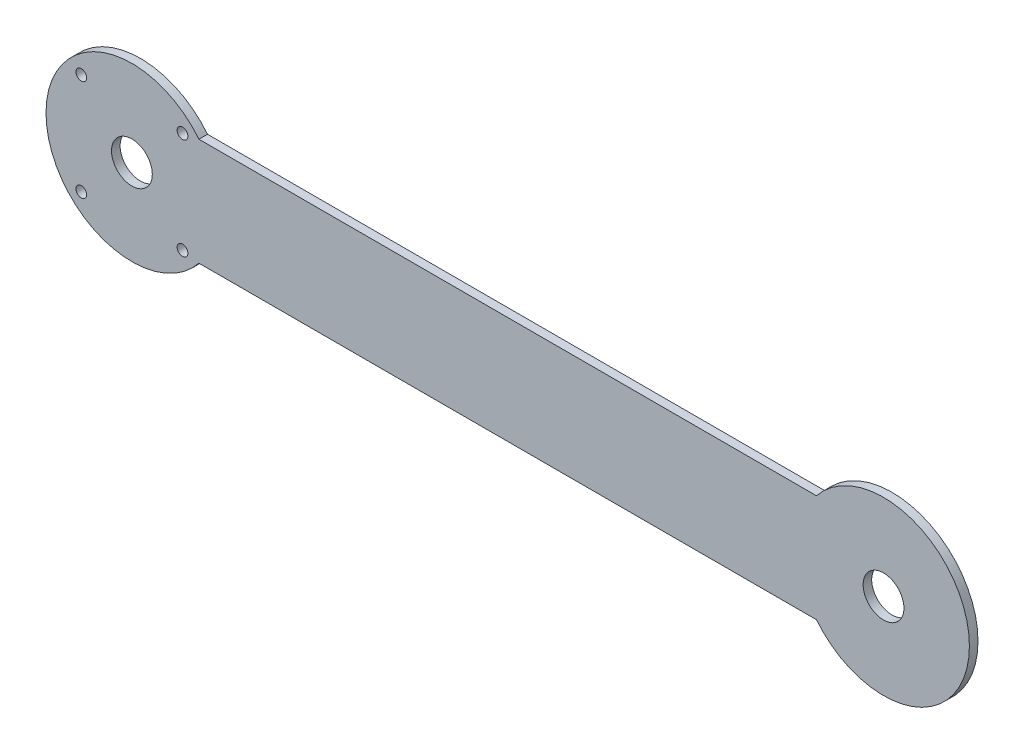
ISO-10303-21;
HEADER;
FILE_DESCRIPTION(('STEP AP214'),'2;1');
FILE_NAME('part.step','',(''),(''),'','','');
FILE_SCHEMA(('AUTOMOTIVE_DESIGN { 1 0 10303 214 1 1 1 1 }'));
ENDSEC;
DATA;
#1=APPLICATION_CONTEXT('core data for automotive mechanical design processes');
#2=APPLICATION_PROTOCOL_DEFINITION('international standard','automotive_design',2000,#1);
#3=PRODUCT_CONTEXT('',#1,'mechanical');
#4=PRODUCT('Part','Part','',(#3));
#5=PRODUCT_RELATED_PRODUCT_CATEGORY('part','',(#4));
#6=PRODUCT_DEFINITION_FORMATION('','',#4);
#7=PRODUCT_DEFINITION_CONTEXT('part definition',#1,'design');
#8=PRODUCT_DEFINITION('design','',#6,#7);
#9=PRODUCT_DEFINITION_SHAPE('','',#8);
#10=(LENGTH_UNIT() NAMED_UNIT(*) SI_UNIT(.MILLI.,.METRE.));
#11=(NAMED_UNIT(*) PLANE_ANGLE_UNIT() SI_UNIT($,.RADIAN.));
#12=(NAMED_UNIT(*) SI_UNIT($,.STERADIAN.) SOLID_ANGLE_UNIT());
#13=UNCERTAINTY_MEASURE_WITH_UNIT(LENGTH_MEASURE(1.E-05),#10,'distance_accuracy_value','');
#14=(GEOMETRIC_REPRESENTATION_CONTEXT(3) GLOBAL_UNCERTAINTY_ASSIGNED_CONTEXT((#13)) GLOBAL_UNIT_ASSIGNED_CONTEXT((#10,
#11,#12)) REPRESENTATION_CONTEXT('',''));
#15=CARTESIAN_POINT('',(0.,0.,0.));
#16=DIRECTION('',(0.,0.,1.));
#17=DIRECTION('',(1.,0.,0.));
#18=AXIS2_PLACEMENT_3D('',#15,#16,#17);
#19=CARTESIAN_POINT('',(0.,0.,4.));
#20=DIRECTION('',(0.,0.,1.));
#21=DIRECTION('',(1.,0.,0.));
#22=AXIS2_PLACEMENT_3D('',#19,#20,#21);
#23=PLANE('',#22);
#24=CARTESIAN_POINT('',(350.,0.,4.));
#25=DIRECTION('',(0.,0.,1.));
#26=DIRECTION('',(1.,0.,0.));
#27=AXIS2_PLACEMENT_3D('',#24,#25,#26);
#28=CIRCLE('',#27,9.50000000000001);
#29=CARTESIAN_POINT('',(359.5,0.,4.));
#30=VERTEX_POINT('',#29);
#31=EDGE_CURVE('E158',#30,#30,#28,.T.);
#32=ORIENTED_EDGE('',*,*,#31,.F.);
#33=EDGE_LOOP('',(#32));
#34=FACE_BOUND('',#33,.T.);
#35=CARTESIAN_POINT('',(23.5700000000013,-23.5699999999987,4.));
#36=DIRECTION('',(0.,0.,1.));
#37=DIRECTION('',(1.,0.,0.));
#38=AXIS2_PLACEMENT_3D('',#35,#36,#37);
#39=CIRCLE('',#38,2.50000000000187);
#40=CARTESIAN_POINT('',(26.0700000000032,-23.5699999999987,4.));
#41=VERTEX_POINT('',#40);
#42=EDGE_CURVE('E142',#41,#41,#39,.T.);
#43=ORIENTED_EDGE('',*,*,#42,.F.);
#44=EDGE_LOOP('',(#43));
#45=FACE_BOUND('',#44,.T.);
#46=CARTESIAN_POINT('',(-23.57,23.57,4.));
#47=DIRECTION('',(0.,0.,1.));
#48=DIRECTION('',(1.,0.,0.));
#49=AXIS2_PLACEMENT_3D('',#46,#47,#48);
#50=CIRCLE('',#49,2.5);
#51=CARTESIAN_POINT('',(-21.07,23.57,4.));
#52=VERTEX_POINT('',#51);
#53=EDGE_CURVE('E112',#52,#52,#50,.T.);
#54=ORIENTED_EDGE('',*,*,#53,.F.);
#55=EDGE_LOOP('',(#54));
#56=FACE_BOUND('',#55,.T.);
#57=CARTESIAN_POINT('',(0.,0.,4.));
#58=DIRECTION('',(0.,0.,1.));
#59=DIRECTION('',(1.,0.,0.));
#60=AXIS2_PLACEMENT_3D('',#57,#58,#59);
#61=CIRCLE('',#60,40.);
#62=CARTESIAN_POINT('',(31.224989991992,25.,4.));
#63=VERTEX_POINT('',#62);
#64=CARTESIAN_POINT('',(31.224989991992,-25.,4.));
#65=VERTEX_POINT('',#64);
#66=EDGE_CURVE('E92',#63,#65,#61,.T.);
#67=ORIENTED_EDGE('',*,*,#66,.T.);
#68=DIRECTION('',(1.,0.,0.));
#69=VECTOR('',#68,1.);
#70=CARTESIAN_POINT('',(31.224989991992,-25.,4.));
#71=LINE('',#70,#69);
#72=CARTESIAN_POINT('',(318.775010008008,-25.,4.));
#73=VERTEX_POINT('',#72);
#74=EDGE_CURVE('E87',#65,#73,#71,.T.);
#75=ORIENTED_EDGE('',*,*,#74,.T.);
#76=CARTESIAN_POINT('',(350.,0.,4.));
#77=DIRECTION('',(0.,0.,1.));
#78=DIRECTION('',(-1.,0.,0.));
#79=AXIS2_PLACEMENT_3D('',#76,#77,#78);
#80=CIRCLE('',#79,40.);
#81=CARTESIAN_POINT('',(318.775010008008,25.,4.));
#82=VERTEX_POINT('',#81);
#83=EDGE_CURVE('E90',#73,#82,#80,.T.);
#84=ORIENTED_EDGE('',*,*,#83,.T.);
#85=DIRECTION('',(-1.,0.,0.));
#86=VECTOR('',#85,1.);
#87=CARTESIAN_POINT('',(31.224989991992,25.,4.));
#88=LINE('',#87,#86);
#89=EDGE_CURVE('E57',#82,#63,#88,.T.);
#90=ORIENTED_EDGE('',*,*,#89,.T.);
#91=EDGE_LOOP('',(#67,#75,#84,#90));
#92=FACE_BOUND('',#91,.T.);
#93=CARTESIAN_POINT('',(23.57,23.5700000000013,4.));
#94=DIRECTION('',(0.,0.,1.));
#95=DIRECTION('',(1.,0.,0.));
#96=AXIS2_PLACEMENT_3D('',#93,#94,#95);
#97=CIRCLE('',#96,2.50000000000138);
#98=CARTESIAN_POINT('',(26.0700000000014,23.5700000000013,4.));
#99=VERTEX_POINT('',#98);
#100=EDGE_CURVE('E134',#99,#99,#97,.T.);
#101=ORIENTED_EDGE('',*,*,#100,.F.);
#102=EDGE_LOOP('',(#101));
#103=FACE_BOUND('',#102,.T.);
#104=CARTESIAN_POINT('',(-23.5699999999987,-23.57,4.));
#105=DIRECTION('',(0.,0.,1.));
#106=DIRECTION('',(1.,0.,0.));
#107=AXIS2_PLACEMENT_3D('',#104,#105,#106);
#108=CIRCLE('',#107,2.50000000000071);
#109=CARTESIAN_POINT('',(-21.069999999998,-23.57,4.));
#110=VERTEX_POINT('',#109);
#111=EDGE_CURVE('E150',#110,#110,#108,.T.);
#112=ORIENTED_EDGE('',*,*,#111,.F.);
#113=EDGE_LOOP('',(#112));
#114=FACE_BOUND('',#113,.T.);
#115=CARTESIAN_POINT('',(0.,0.,4.));
#116=DIRECTION('',(0.,0.,1.));
#117=DIRECTION('',(1.,0.,0.));
#118=AXIS2_PLACEMENT_3D('',#115,#116,#117);
#119=CIRCLE('',#118,9.5);
#120=CARTESIAN_POINT('',(9.5,0.,4.));
#121=VERTEX_POINT('',#120);
#122=EDGE_CURVE('E166',#121,#121,#119,.T.);
#123=ORIENTED_EDGE('',*,*,#122,.F.);
#124=EDGE_LOOP('',(#123));
#125=FACE_BOUND('',#124,.T.);
#126=ADVANCED_FACE('F39',(#34,#45,#56,#92,#103,#114,#125),#23,.T.);
#127=CARTESIAN_POINT('',(0.,0.,0.));
#128=DIRECTION('',(0.,0.,1.));
#129=DIRECTION('',(1.,0.,0.));
#130=AXIS2_PLACEMENT_3D('',#127,#128,#129);
#131=PLANE('',#130);
#132=CARTESIAN_POINT('',(0.,0.,0.));
#133=DIRECTION('',(0.,0.,1.));
#134=DIRECTION('',(1.,0.,0.));
#135=AXIS2_PLACEMENT_3D('',#132,#133,#134);
#136=CIRCLE('',#135,40.);
#137=CARTESIAN_POINT('',(31.224989991992,25.,0.));
#138=VERTEX_POINT('',#137);
#139=CARTESIAN_POINT('',(31.224989991992,-25.,0.));
#140=VERTEX_POINT('',#139);
#141=EDGE_CURVE('E108',#138,#140,#136,.T.);
#142=ORIENTED_EDGE('',*,*,#141,.F.);
#143=DIRECTION('',(-1.,0.,0.));
#144=VECTOR('',#143,1.);
#145=CARTESIAN_POINT('',(31.224989991992,25.,0.));
#146=LINE('',#145,#144);
#147=CARTESIAN_POINT('',(318.775010008008,25.,0.));
#148=VERTEX_POINT('',#147);
#149=EDGE_CURVE('E80',#148,#138,#146,.T.);
#150=ORIENTED_EDGE('',*,*,#149,.F.);
#151=CARTESIAN_POINT('',(350.,0.,0.));
#152=DIRECTION('',(0.,0.,1.));
#153=DIRECTION('',(-1.,0.,0.));
#154=AXIS2_PLACEMENT_3D('',#151,#152,#153);
#155=CIRCLE('',#154,40.);
#156=CARTESIAN_POINT('',(318.775010008008,-25.,0.));
#157=VERTEX_POINT('',#156);
#158=EDGE_CURVE('E74',#157,#148,#155,.T.);
#159=ORIENTED_EDGE('',*,*,#158,.F.);
#160=DIRECTION('',(1.,0.,0.));
#161=VECTOR('',#160,1.);
#162=CARTESIAN_POINT('',(31.224989991992,-25.,0.));
#163=LINE('',#162,#161);
#164=EDGE_CURVE('E97',#140,#157,#163,.T.);
#165=ORIENTED_EDGE('',*,*,#164,.F.);
#166=EDGE_LOOP('',(#142,#150,#159,#165));
#167=FACE_BOUND('',#166,.T.);
#168=CARTESIAN_POINT('',(-23.57,23.57,0.));
#169=DIRECTION('',(0.,0.,1.));
#170=DIRECTION('',(1.,0.,0.));
#171=AXIS2_PLACEMENT_3D('',#168,#169,#170);
#172=CIRCLE('',#171,2.5);
#173=CARTESIAN_POINT('',(-21.07,23.57,0.));
#174=VERTEX_POINT('',#173);
#175=EDGE_CURVE('E130',#174,#174,#172,.T.);
#176=ORIENTED_EDGE('',*,*,#175,.T.);
#177=EDGE_LOOP('',(#176));
#178=FACE_BOUND('',#177,.T.);
#179=CARTESIAN_POINT('',(23.57,23.5700000000013,0.));
#180=DIRECTION('',(0.,0.,1.));
#181=DIRECTION('',(1.,0.,0.));
#182=AXIS2_PLACEMENT_3D('',#179,#180,#181);
#183=CIRCLE('',#182,2.50000000000138);
#184=CARTESIAN_POINT('',(26.0700000000014,23.5700000000013,0.));
#185=VERTEX_POINT('',#184);
#186=EDGE_CURVE('E138',#185,#185,#183,.T.);
#187=ORIENTED_EDGE('',*,*,#186,.T.);
#188=EDGE_LOOP('',(#187));
#189=FACE_BOUND('',#188,.T.);
#190=CARTESIAN_POINT('',(23.5700000000013,-23.5699999999987,0.));
#191=DIRECTION('',(0.,0.,1.));
#192=DIRECTION('',(1.,0.,0.));
#193=AXIS2_PLACEMENT_3D('',#190,#191,#192);
#194=CIRCLE('',#193,2.50000000000187);
#195=CARTESIAN_POINT('',(26.0700000000032,-23.5699999999987,0.));
#196=VERTEX_POINT('',#195);
#197=EDGE_CURVE('E146',#196,#196,#194,.T.);
#198=ORIENTED_EDGE('',*,*,#197,.T.);
#199=EDGE_LOOP('',(#198));
#200=FACE_BOUND('',#199,.T.);
#201=CARTESIAN_POINT('',(-23.5699999999987,-23.57,0.));
#202=DIRECTION('',(0.,0.,1.));
#203=DIRECTION('',(1.,0.,0.));
#204=AXIS2_PLACEMENT_3D('',#201,#202,#203);
#205=CIRCLE('',#204,2.50000000000071);
#206=CARTESIAN_POINT('',(-21.069999999998,-23.57,0.));
#207=VERTEX_POINT('',#206);
#208=EDGE_CURVE('E154',#207,#207,#205,.T.);
#209=ORIENTED_EDGE('',*,*,#208,.T.);
#210=EDGE_LOOP('',(#209));
#211=FACE_BOUND('',#210,.T.);
#212=CARTESIAN_POINT('',(350.,0.,0.));
#213=DIRECTION('',(0.,0.,1.));
#214=DIRECTION('',(1.,0.,0.));
#215=AXIS2_PLACEMENT_3D('',#212,#213,#214);
#216=CIRCLE('',#215,9.50000000000001);
#217=CARTESIAN_POINT('',(359.5,0.,0.));
#218=VERTEX_POINT('',#217);
#219=EDGE_CURVE('E162',#218,#218,#216,.T.);
#220=ORIENTED_EDGE('',*,*,#219,.T.);
#221=EDGE_LOOP('',(#220));
#222=FACE_BOUND('',#221,.T.);
#223=CARTESIAN_POINT('',(0.,0.,0.));
#224=DIRECTION('',(0.,0.,1.));
#225=DIRECTION('',(1.,0.,0.));
#226=AXIS2_PLACEMENT_3D('',#223,#224,#225);
#227=CIRCLE('',#226,9.5);
#228=CARTESIAN_POINT('',(9.5,0.,0.));
#229=VERTEX_POINT('',#228);
#230=EDGE_CURVE('E170',#229,#229,#227,.T.);
#231=ORIENTED_EDGE('',*,*,#230,.T.);
#232=EDGE_LOOP('',(#231));
#233=FACE_BOUND('',#232,.T.);
#234=ADVANCED_FACE('F125',(#167,#178,#189,#200,#211,#222,#233),#131,.F.);
#235=CARTESIAN_POINT('',(0.,0.,4.));
#236=DIRECTION('',(0.,0.,-1.));
#237=DIRECTION('',(-1.,0.,0.));
#238=AXIS2_PLACEMENT_3D('',#235,#236,#237);
#239=CYLINDRICAL_SURFACE('',#238,40.);
#240=ORIENTED_EDGE('',*,*,#141,.T.);
#241=DIRECTION('',(0.,0.,-1.));
#242=VECTOR('',#241,1.);
#243=CARTESIAN_POINT('',(31.224989991992,-25.,4.));
#244=LINE('',#243,#242);
#245=EDGE_CURVE('E11',#65,#140,#244,.T.);
#246=ORIENTED_EDGE('',*,*,#245,.F.);
#247=ORIENTED_EDGE('',*,*,#66,.F.);
#248=DIRECTION('',(0.,0.,-1.));
#249=VECTOR('',#248,1.);
#250=CARTESIAN_POINT('',(31.224989991992,25.,4.));
#251=LINE('',#250,#249);
#252=EDGE_CURVE('E104',#63,#138,#251,.T.);
#253=ORIENTED_EDGE('',*,*,#252,.T.);
#254=EDGE_LOOP('',(#240,#246,#247,#253));
#255=FACE_BOUND('',#254,.T.);
#256=ADVANCED_FACE('F41',(#255),#239,.T.);
#257=CARTESIAN_POINT('',(31.224989991992,-25.,4.));
#258=DIRECTION('',(0.,1.,0.));
#259=DIRECTION('',(0.,0.,1.));
#260=AXIS2_PLACEMENT_3D('',#257,#258,#259);
#261=PLANE('',#260);
#262=ORIENTED_EDGE('',*,*,#164,.T.);
#263=DIRECTION('',(0.,0.,-1.));
#264=VECTOR('',#263,1.);
#265=CARTESIAN_POINT('',(318.775010008008,-25.,4.));
#266=LINE('',#265,#264);
#267=EDGE_CURVE('E49',#73,#157,#266,.T.);
#268=ORIENTED_EDGE('',*,*,#267,.F.);
#269=ORIENTED_EDGE('',*,*,#74,.F.);
#270=ORIENTED_EDGE('',*,*,#245,.T.);
#271=EDGE_LOOP('',(#262,#268,#269,#270));
#272=FACE_BOUND('',#271,.T.);
#273=ADVANCED_FACE('F96',(#272),#261,.F.);
#274=CARTESIAN_POINT('',(350.,0.,4.));
#275=DIRECTION('',(0.,0.,-1.));
#276=DIRECTION('',(-1.,0.,0.));
#277=AXIS2_PLACEMENT_3D('',#274,#275,#276);
#278=CYLINDRICAL_SURFACE('',#277,40.);
#279=ORIENTED_EDGE('',*,*,#158,.T.);
#280=DIRECTION('',(0.,0.,-1.));
#281=VECTOR('',#280,1.);
#282=CARTESIAN_POINT('',(318.775010008008,25.,4.));
#283=LINE('',#282,#281);
#284=EDGE_CURVE('E99',#82,#148,#283,.T.);
#285=ORIENTED_EDGE('',*,*,#284,.F.);
#286=ORIENTED_EDGE('',*,*,#83,.F.);
#287=ORIENTED_EDGE('',*,*,#267,.T.);
#288=EDGE_LOOP('',(#279,#285,#286,#287));
#289=FACE_BOUND('',#288,.T.);
#290=ADVANCED_FACE('F100',(#289),#278,.T.);
#291=CARTESIAN_POINT('',(31.224989991992,25.,4.));
#292=DIRECTION('',(0.,-1.,0.));
#293=DIRECTION('',(0.,0.,-1.));
#294=AXIS2_PLACEMENT_3D('',#291,#292,#293);
#295=PLANE('',#294);
#296=ORIENTED_EDGE('',*,*,#149,.T.);
#297=ORIENTED_EDGE('',*,*,#252,.F.);
#298=ORIENTED_EDGE('',*,*,#89,.F.);
#299=ORIENTED_EDGE('',*,*,#284,.T.);
#300=EDGE_LOOP('',(#296,#297,#298,#299));
#301=FACE_BOUND('',#300,.T.);
#302=ADVANCED_FACE('F122',(#301),#295,.F.);
#303=CARTESIAN_POINT('',(-23.57,23.57,4.));
#304=DIRECTION('',(0.,0.,-1.));
#305=DIRECTION('',(-1.,0.,0.));
#306=AXIS2_PLACEMENT_3D('',#303,#304,#305);
#307=CYLINDRICAL_SURFACE('',#306,2.5);
#308=ORIENTED_EDGE('',*,*,#53,.T.);
#309=EDGE_LOOP('',(#308));
#310=FACE_BOUND('',#309,.T.);
#311=ORIENTED_EDGE('',*,*,#175,.F.);
#312=EDGE_LOOP('',(#311));
#313=FACE_BOUND('',#312,.T.);
#314=ADVANCED_FACE('F191',(#310,#313),#307,.F.);
#315=CARTESIAN_POINT('',(23.57,23.5700000000013,4.));
#316=DIRECTION('',(0.,0.,-1.));
#317=DIRECTION('',(-1.,0.,0.));
#318=AXIS2_PLACEMENT_3D('',#315,#316,#317);
#319=CYLINDRICAL_SURFACE('',#318,2.50000000000138);
#320=ORIENTED_EDGE('',*,*,#100,.T.);
#321=EDGE_LOOP('',(#320));
#322=FACE_BOUND('',#321,.T.);
#323=ORIENTED_EDGE('',*,*,#186,.F.);
#324=EDGE_LOOP('',(#323));
#325=FACE_BOUND('',#324,.T.);
#326=ADVANCED_FACE('F237',(#322,#325),#319,.F.);
#327=CARTESIAN_POINT('',(23.5700000000013,-23.5699999999987,4.));
#328=DIRECTION('',(0.,0.,-1.));
#329=DIRECTION('',(-1.,0.,0.));
#330=AXIS2_PLACEMENT_3D('',#327,#328,#329);
#331=CYLINDRICAL_SURFACE('',#330,2.50000000000187);
#332=ORIENTED_EDGE('',*,*,#42,.T.);
#333=EDGE_LOOP('',(#332));
#334=FACE_BOUND('',#333,.T.);
#335=ORIENTED_EDGE('',*,*,#197,.F.);
#336=EDGE_LOOP('',(#335));
#337=FACE_BOUND('',#336,.T.);
#338=ADVANCED_FACE('F245',(#334,#337),#331,.F.);
#339=CARTESIAN_POINT('',(-23.5699999999987,-23.57,4.));
#340=DIRECTION('',(0.,0.,-1.));
#341=DIRECTION('',(-1.,0.,0.));
#342=AXIS2_PLACEMENT_3D('',#339,#340,#341);
#343=CYLINDRICAL_SURFACE('',#342,2.50000000000071);
#344=ORIENTED_EDGE('',*,*,#111,.T.);
#345=EDGE_LOOP('',(#344));
#346=FACE_BOUND('',#345,.T.);
#347=ORIENTED_EDGE('',*,*,#208,.F.);
#348=EDGE_LOOP('',(#347));
#349=FACE_BOUND('',#348,.T.);
#350=ADVANCED_FACE('F253',(#346,#349),#343,.F.);
#351=CARTESIAN_POINT('',(350.,0.,4.));
#352=DIRECTION('',(0.,0.,-1.));
#353=DIRECTION('',(-1.,0.,0.));
#354=AXIS2_PLACEMENT_3D('',#351,#352,#353);
#355=CYLINDRICAL_SURFACE('',#354,9.50000000000001);
#356=ORIENTED_EDGE('',*,*,#31,.T.);
#357=EDGE_LOOP('',(#356));
#358=FACE_BOUND('',#357,.T.);
#359=ORIENTED_EDGE('',*,*,#219,.F.);
#360=EDGE_LOOP('',(#359));
#361=FACE_BOUND('',#360,.T.);
#362=ADVANCED_FACE('F262',(#358,#361),#355,.F.);
#363=CARTESIAN_POINT('',(0.,0.,4.));
#364=DIRECTION('',(0.,0.,-1.));
#365=DIRECTION('',(-1.,0.,0.));
#366=AXIS2_PLACEMENT_3D('',#363,#364,#365);
#367=CYLINDRICAL_SURFACE('',#366,9.5);
#368=ORIENTED_EDGE('',*,*,#122,.T.);
#369=EDGE_LOOP('',(#368));
#370=FACE_BOUND('',#369,.T.);
#371=ORIENTED_EDGE('',*,*,#230,.F.);
#372=EDGE_LOOP('',(#371));
#373=FACE_BOUND('',#372,.T.);
#374=ADVANCED_FACE('F178',(#370,#373),#367,.F.);
#375=CLOSED_SHELL('',(#126,#234,#256,#273,#290,#302,#314,#326,#338,#350,#362,#374));
#376=MANIFOLD_SOLID_BREP('B2',#375);
#377=ADVANCED_BREP_SHAPE_REPRESENTATION('',(#18,#376),#14);
#378=SHAPE_DEFINITION_REPRESENTATION(#9,#377);
ENDSEC;
END-ISO-10303-21;
